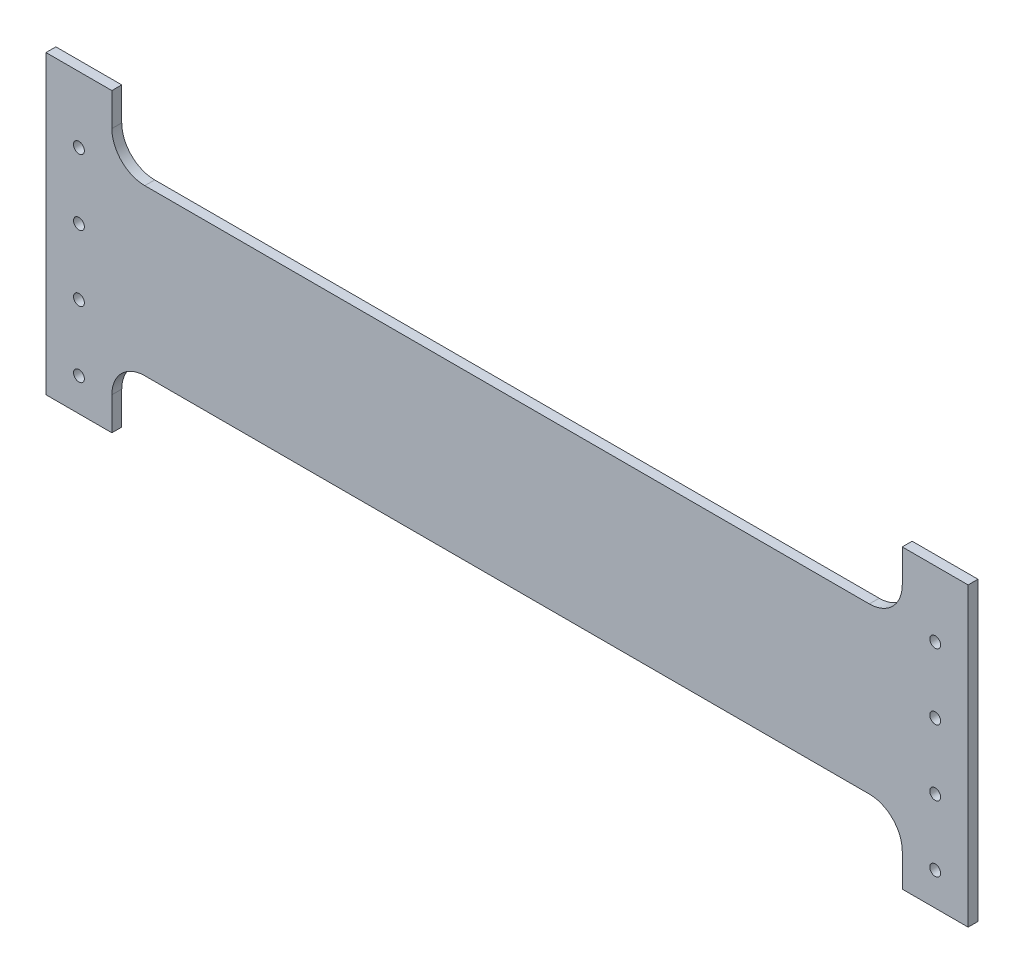
ISO-10303-21;
HEADER;
FILE_DESCRIPTION(('STEP AP214'),'2;1');
FILE_NAME('part.step','',(''),(''),'','','');
FILE_SCHEMA(('AUTOMOTIVE_DESIGN { 1 0 10303 214 1 1 1 1 }'));
ENDSEC;
DATA;
#1=APPLICATION_CONTEXT('core data for automotive mechanical design processes');
#2=APPLICATION_PROTOCOL_DEFINITION('international standard','automotive_design',2000,#1);
#3=PRODUCT_CONTEXT('',#1,'mechanical');
#4=PRODUCT('Part','Part','',(#3));
#5=PRODUCT_RELATED_PRODUCT_CATEGORY('part','',(#4));
#6=PRODUCT_DEFINITION_FORMATION('','',#4);
#7=PRODUCT_DEFINITION_CONTEXT('part definition',#1,'design');
#8=PRODUCT_DEFINITION('design','',#6,#7);
#9=PRODUCT_DEFINITION_SHAPE('','',#8);
#10=(LENGTH_UNIT() NAMED_UNIT(*) SI_UNIT(.MILLI.,.METRE.));
#11=(NAMED_UNIT(*) PLANE_ANGLE_UNIT() SI_UNIT($,.RADIAN.));
#12=(NAMED_UNIT(*) SI_UNIT($,.STERADIAN.) SOLID_ANGLE_UNIT());
#13=UNCERTAINTY_MEASURE_WITH_UNIT(LENGTH_MEASURE(1.E-05),#10,'distance_accuracy_value','');
#14=(GEOMETRIC_REPRESENTATION_CONTEXT(3) GLOBAL_UNCERTAINTY_ASSIGNED_CONTEXT((#13)) GLOBAL_UNIT_ASSIGNED_CONTEXT((#10,
#11,#12)) REPRESENTATION_CONTEXT('',''));
#15=CARTESIAN_POINT('',(0.,0.,0.));
#16=DIRECTION('',(0.,0.,1.));
#17=DIRECTION('',(1.,0.,0.));
#18=AXIS2_PLACEMENT_3D('',#15,#16,#17);
#19=CARTESIAN_POINT('',(-110.,35.,3.));
#20=DIRECTION('',(0.,0.,-1.));
#21=DIRECTION('',(-1.,0.,0.));
#22=AXIS2_PLACEMENT_3D('',#19,#20,#21);
#23=PLANE('',#22);
#24=DIRECTION('',(1.,0.,0.));
#25=VECTOR('',#24,1.);
#26=CARTESIAN_POINT('',(-120.,-44.9999999999999,3.));
#27=LINE('',#26,#25);
#28=CARTESIAN_POINT('',(-140.,-44.9999999999999,3.));
#29=VERTEX_POINT('',#28);
#30=CARTESIAN_POINT('',(-120.,-44.9999999999999,3.));
#31=VERTEX_POINT('',#30);
#32=EDGE_CURVE('E217',#29,#31,#27,.T.);
#33=ORIENTED_EDGE('',*,*,#32,.T.);
#34=DIRECTION('',(0.,1.,0.));
#35=VECTOR('',#34,1.);
#36=CARTESIAN_POINT('',(-120.,-44.9999999999999,3.));
#37=LINE('',#36,#35);
#38=CARTESIAN_POINT('',(-120.,-35.,3.));
#39=VERTEX_POINT('',#38);
#40=EDGE_CURVE('E125',#31,#39,#37,.T.);
#41=ORIENTED_EDGE('',*,*,#40,.T.);
#42=CARTESIAN_POINT('',(-110.,-35.,3.));
#43=DIRECTION('',(0.,0.,-1.));
#44=DIRECTION('',(-1.,0.,0.));
#45=AXIS2_PLACEMENT_3D('',#42,#43,#44);
#46=CIRCLE('',#45,9.99999999999998);
#47=CARTESIAN_POINT('',(-110.,-25.,3.));
#48=VERTEX_POINT('',#47);
#49=EDGE_CURVE('E256',#39,#48,#46,.T.);
#50=ORIENTED_EDGE('',*,*,#49,.T.);
#51=DIRECTION('',(1.,0.,0.));
#52=VECTOR('',#51,1.);
#53=CARTESIAN_POINT('',(-110.,-25.,3.));
#54=LINE('',#53,#52);
#55=CARTESIAN_POINT('',(110.,-25.,3.));
#56=VERTEX_POINT('',#55);
#57=EDGE_CURVE('E275',#48,#56,#54,.T.);
#58=ORIENTED_EDGE('',*,*,#57,.T.);
#59=CARTESIAN_POINT('',(110.,-35.,3.));
#60=DIRECTION('',(0.,0.,-1.));
#61=DIRECTION('',(1.,0.,0.));
#62=AXIS2_PLACEMENT_3D('',#59,#60,#61);
#63=CIRCLE('',#62,9.99999999999998);
#64=CARTESIAN_POINT('',(120.,-35.,3.));
#65=VERTEX_POINT('',#64);
#66=EDGE_CURVE('E272',#56,#65,#63,.T.);
#67=ORIENTED_EDGE('',*,*,#66,.T.);
#68=DIRECTION('',(0.,-1.,0.));
#69=VECTOR('',#68,1.);
#70=CARTESIAN_POINT('',(120.,-44.9999999999999,3.));
#71=LINE('',#70,#69);
#72=CARTESIAN_POINT('',(120.,-44.9999999999999,3.));
#73=VERTEX_POINT('',#72);
#74=EDGE_CURVE('E274',#65,#73,#71,.T.);
#75=ORIENTED_EDGE('',*,*,#74,.T.);
#76=DIRECTION('',(1.,0.,0.));
#77=VECTOR('',#76,1.);
#78=CARTESIAN_POINT('',(120.,-44.9999999999999,3.));
#79=LINE('',#78,#77);
#80=CARTESIAN_POINT('',(140.,-44.9999999999999,3.));
#81=VERTEX_POINT('',#80);
#82=EDGE_CURVE('E277',#73,#81,#79,.T.);
#83=ORIENTED_EDGE('',*,*,#82,.T.);
#84=DIRECTION('',(0.,1.,0.));
#85=VECTOR('',#84,1.);
#86=CARTESIAN_POINT('',(140.,45.,3.));
#87=LINE('',#86,#85);
#88=CARTESIAN_POINT('',(140.,45.,3.));
#89=VERTEX_POINT('',#88);
#90=EDGE_CURVE('E283',#81,#89,#87,.T.);
#91=ORIENTED_EDGE('',*,*,#90,.T.);
#92=DIRECTION('',(-1.,0.,0.));
#93=VECTOR('',#92,1.);
#94=CARTESIAN_POINT('',(120.,45.,3.));
#95=LINE('',#94,#93);
#96=CARTESIAN_POINT('',(120.,45.,3.));
#97=VERTEX_POINT('',#96);
#98=EDGE_CURVE('E285',#89,#97,#95,.T.);
#99=ORIENTED_EDGE('',*,*,#98,.T.);
#100=DIRECTION('',(0.,-1.,0.));
#101=VECTOR('',#100,1.);
#102=CARTESIAN_POINT('',(120.,35.,3.));
#103=LINE('',#102,#101);
#104=CARTESIAN_POINT('',(120.,35.,3.));
#105=VERTEX_POINT('',#104);
#106=EDGE_CURVE('E287',#97,#105,#103,.T.);
#107=ORIENTED_EDGE('',*,*,#106,.T.);
#108=CARTESIAN_POINT('',(110.,35.,3.));
#109=DIRECTION('',(0.,0.,-1.));
#110=DIRECTION('',(-1.,0.,0.));
#111=AXIS2_PLACEMENT_3D('',#108,#109,#110);
#112=CIRCLE('',#111,10.);
#113=CARTESIAN_POINT('',(110.,25.,3.));
#114=VERTEX_POINT('',#113);
#115=EDGE_CURVE('E289',#105,#114,#112,.T.);
#116=ORIENTED_EDGE('',*,*,#115,.T.);
#117=DIRECTION('',(-1.,0.,0.));
#118=VECTOR('',#117,1.);
#119=CARTESIAN_POINT('',(-110.,25.,3.));
#120=LINE('',#119,#118);
#121=CARTESIAN_POINT('',(-110.,25.,3.));
#122=VERTEX_POINT('',#121);
#123=EDGE_CURVE('E291',#114,#122,#120,.T.);
#124=ORIENTED_EDGE('',*,*,#123,.T.);
#125=CARTESIAN_POINT('',(-110.,35.,3.));
#126=DIRECTION('',(0.,0.,-1.));
#127=DIRECTION('',(-1.,0.,0.));
#128=AXIS2_PLACEMENT_3D('',#125,#126,#127);
#129=CIRCLE('',#128,10.);
#130=CARTESIAN_POINT('',(-120.,35.,3.));
#131=VERTEX_POINT('',#130);
#132=EDGE_CURVE('E168',#122,#131,#129,.T.);
#133=ORIENTED_EDGE('',*,*,#132,.T.);
#134=DIRECTION('',(0.,1.,0.));
#135=VECTOR('',#134,1.);
#136=CARTESIAN_POINT('',(-120.,35.,3.));
#137=LINE('',#136,#135);
#138=CARTESIAN_POINT('',(-120.,45.,3.));
#139=VERTEX_POINT('',#138);
#140=EDGE_CURVE('E162',#131,#139,#137,.T.);
#141=ORIENTED_EDGE('',*,*,#140,.T.);
#142=DIRECTION('',(-1.,0.,0.));
#143=VECTOR('',#142,1.);
#144=CARTESIAN_POINT('',(-120.,45.,3.));
#145=LINE('',#144,#143);
#146=CARTESIAN_POINT('',(-140.,45.,3.));
#147=VERTEX_POINT('',#146);
#148=EDGE_CURVE('E166',#139,#147,#145,.T.);
#149=ORIENTED_EDGE('',*,*,#148,.T.);
#150=DIRECTION('',(0.,-1.,0.));
#151=VECTOR('',#150,1.);
#152=CARTESIAN_POINT('',(-140.,45.,3.));
#153=LINE('',#152,#151);
#154=EDGE_CURVE('E58',#147,#29,#153,.T.);
#155=ORIENTED_EDGE('',*,*,#154,.T.);
#156=EDGE_LOOP('',(#33,#41,#50,#58,#67,#75,#83,#91,#99,#107,#116,#124,#133,#141,#149,#155));
#157=FACE_BOUND('',#156,.T.);
#158=CARTESIAN_POINT('',(-130.,25.,3.));
#159=DIRECTION('',(0.,0.,1.));
#160=DIRECTION('',(1.,0.,0.));
#161=AXIS2_PLACEMENT_3D('',#158,#159,#160);
#162=CIRCLE('',#161,1.65000000000002);
#163=CARTESIAN_POINT('',(-128.35,25.,3.));
#164=VERTEX_POINT('',#163);
#165=EDGE_CURVE('E190',#164,#164,#162,.T.);
#166=ORIENTED_EDGE('',*,*,#165,.F.);
#167=EDGE_LOOP('',(#166));
#168=FACE_BOUND('',#167,.T.);
#169=CARTESIAN_POINT('',(-130.,4.99999999999999,3.));
#170=DIRECTION('',(0.,0.,1.));
#171=DIRECTION('',(1.,0.,0.));
#172=AXIS2_PLACEMENT_3D('',#169,#170,#171);
#173=CIRCLE('',#172,1.65000000000002);
#174=CARTESIAN_POINT('',(-128.35,4.99999999999999,3.));
#175=VERTEX_POINT('',#174);
#176=EDGE_CURVE('E395',#175,#175,#173,.T.);
#177=ORIENTED_EDGE('',*,*,#176,.F.);
#178=EDGE_LOOP('',(#177));
#179=FACE_BOUND('',#178,.T.);
#180=CARTESIAN_POINT('',(-130.,-15.,3.));
#181=DIRECTION('',(0.,0.,1.));
#182=DIRECTION('',(1.,0.,0.));
#183=AXIS2_PLACEMENT_3D('',#180,#181,#182);
#184=CIRCLE('',#183,1.65000000000002);
#185=CARTESIAN_POINT('',(-128.35,-15.,3.));
#186=VERTEX_POINT('',#185);
#187=EDGE_CURVE('E389',#186,#186,#184,.T.);
#188=ORIENTED_EDGE('',*,*,#187,.F.);
#189=EDGE_LOOP('',(#188));
#190=FACE_BOUND('',#189,.T.);
#191=CARTESIAN_POINT('',(-130.,-35.,3.));
#192=DIRECTION('',(0.,0.,1.));
#193=DIRECTION('',(1.,0.,0.));
#194=AXIS2_PLACEMENT_3D('',#191,#192,#193);
#195=CIRCLE('',#194,1.65000000000002);
#196=CARTESIAN_POINT('',(-128.35,-35.,3.));
#197=VERTEX_POINT('',#196);
#198=EDGE_CURVE('E383',#197,#197,#195,.T.);
#199=ORIENTED_EDGE('',*,*,#198,.F.);
#200=EDGE_LOOP('',(#199));
#201=FACE_BOUND('',#200,.T.);
#202=CARTESIAN_POINT('',(130.,-35.,3.));
#203=DIRECTION('',(0.,0.,1.));
#204=DIRECTION('',(-1.,0.,0.));
#205=AXIS2_PLACEMENT_3D('',#202,#203,#204);
#206=CIRCLE('',#205,1.65000000000002);
#207=CARTESIAN_POINT('',(128.35,-35.,3.));
#208=VERTEX_POINT('',#207);
#209=EDGE_CURVE('E377',#208,#208,#206,.T.);
#210=ORIENTED_EDGE('',*,*,#209,.F.);
#211=EDGE_LOOP('',(#210));
#212=FACE_BOUND('',#211,.T.);
#213=CARTESIAN_POINT('',(130.,-15.,3.));
#214=DIRECTION('',(0.,0.,1.));
#215=DIRECTION('',(-1.,0.,0.));
#216=AXIS2_PLACEMENT_3D('',#213,#214,#215);
#217=CIRCLE('',#216,1.65000000000002);
#218=CARTESIAN_POINT('',(128.35,-15.,3.));
#219=VERTEX_POINT('',#218);
#220=EDGE_CURVE('E371',#219,#219,#217,.T.);
#221=ORIENTED_EDGE('',*,*,#220,.F.);
#222=EDGE_LOOP('',(#221));
#223=FACE_BOUND('',#222,.T.);
#224=CARTESIAN_POINT('',(130.,4.99999999999999,3.));
#225=DIRECTION('',(0.,0.,1.));
#226=DIRECTION('',(-1.,0.,0.));
#227=AXIS2_PLACEMENT_3D('',#224,#225,#226);
#228=CIRCLE('',#227,1.65000000000002);
#229=CARTESIAN_POINT('',(128.35,4.99999999999999,3.));
#230=VERTEX_POINT('',#229);
#231=EDGE_CURVE('E365',#230,#230,#228,.T.);
#232=ORIENTED_EDGE('',*,*,#231,.F.);
#233=EDGE_LOOP('',(#232));
#234=FACE_BOUND('',#233,.T.);
#235=CARTESIAN_POINT('',(130.,25.,3.));
#236=DIRECTION('',(0.,0.,1.));
#237=DIRECTION('',(-1.,0.,0.));
#238=AXIS2_PLACEMENT_3D('',#235,#236,#237);
#239=CIRCLE('',#238,1.65000000000002);
#240=CARTESIAN_POINT('',(128.35,25.,3.));
#241=VERTEX_POINT('',#240);
#242=EDGE_CURVE('E356',#241,#241,#239,.T.);
#243=ORIENTED_EDGE('',*,*,#242,.F.);
#244=EDGE_LOOP('',(#243));
#245=FACE_BOUND('',#244,.T.);
#246=ADVANCED_FACE('F41',(#157,#168,#179,#190,#201,#212,#223,#234,#245),#23,.F.);
#247=CARTESIAN_POINT('',(-110.,35.,0.));
#248=DIRECTION('',(0.,0.,-1.));
#249=DIRECTION('',(-1.,0.,0.));
#250=AXIS2_PLACEMENT_3D('',#247,#248,#249);
#251=PLANE('',#250);
#252=CARTESIAN_POINT('',(130.,4.99999999999999,0.));
#253=DIRECTION('',(0.,0.,1.));
#254=DIRECTION('',(-1.,0.,0.));
#255=AXIS2_PLACEMENT_3D('',#252,#253,#254);
#256=CIRCLE('',#255,1.65000000000002);
#257=CARTESIAN_POINT('',(128.35,4.99999999999999,0.));
#258=VERTEX_POINT('',#257);
#259=EDGE_CURVE('E362',#258,#258,#256,.T.);
#260=ORIENTED_EDGE('',*,*,#259,.T.);
#261=EDGE_LOOP('',(#260));
#262=FACE_BOUND('',#261,.T.);
#263=CARTESIAN_POINT('',(130.,-35.,0.));
#264=DIRECTION('',(0.,0.,1.));
#265=DIRECTION('',(-1.,0.,0.));
#266=AXIS2_PLACEMENT_3D('',#263,#264,#265);
#267=CIRCLE('',#266,1.65000000000002);
#268=CARTESIAN_POINT('',(128.35,-35.,0.));
#269=VERTEX_POINT('',#268);
#270=EDGE_CURVE('E374',#269,#269,#267,.T.);
#271=ORIENTED_EDGE('',*,*,#270,.T.);
#272=EDGE_LOOP('',(#271));
#273=FACE_BOUND('',#272,.T.);
#274=CARTESIAN_POINT('',(-130.,-15.,0.));
#275=DIRECTION('',(0.,0.,1.));
#276=DIRECTION('',(1.,0.,0.));
#277=AXIS2_PLACEMENT_3D('',#274,#275,#276);
#278=CIRCLE('',#277,1.65000000000002);
#279=CARTESIAN_POINT('',(-128.35,-15.,0.));
#280=VERTEX_POINT('',#279);
#281=EDGE_CURVE('E386',#280,#280,#278,.T.);
#282=ORIENTED_EDGE('',*,*,#281,.T.);
#283=EDGE_LOOP('',(#282));
#284=FACE_BOUND('',#283,.T.);
#285=CARTESIAN_POINT('',(-130.,25.,0.));
#286=DIRECTION('',(0.,0.,1.));
#287=DIRECTION('',(1.,0.,0.));
#288=AXIS2_PLACEMENT_3D('',#285,#286,#287);
#289=CIRCLE('',#288,1.65000000000002);
#290=CARTESIAN_POINT('',(-128.35,25.,0.));
#291=VERTEX_POINT('',#290);
#292=EDGE_CURVE('E398',#291,#291,#289,.T.);
#293=ORIENTED_EDGE('',*,*,#292,.T.);
#294=EDGE_LOOP('',(#293));
#295=FACE_BOUND('',#294,.T.);
#296=DIRECTION('',(1.,0.,0.));
#297=VECTOR('',#296,1.);
#298=CARTESIAN_POINT('',(-120.,-44.9999999999999,0.));
#299=LINE('',#298,#297);
#300=CARTESIAN_POINT('',(-140.,-44.9999999999999,0.));
#301=VERTEX_POINT('',#300);
#302=CARTESIAN_POINT('',(-120.,-44.9999999999999,0.));
#303=VERTEX_POINT('',#302);
#304=EDGE_CURVE('E186',#301,#303,#299,.T.);
#305=ORIENTED_EDGE('',*,*,#304,.F.);
#306=DIRECTION('',(0.,-1.,0.));
#307=VECTOR('',#306,1.);
#308=CARTESIAN_POINT('',(-140.,45.,0.));
#309=LINE('',#308,#307);
#310=CARTESIAN_POINT('',(-140.,45.,0.));
#311=VERTEX_POINT('',#310);
#312=EDGE_CURVE('E117',#311,#301,#309,.T.);
#313=ORIENTED_EDGE('',*,*,#312,.F.);
#314=DIRECTION('',(-1.,0.,0.));
#315=VECTOR('',#314,1.);
#316=CARTESIAN_POINT('',(-120.,45.,0.));
#317=LINE('',#316,#315);
#318=CARTESIAN_POINT('',(-120.,45.,0.));
#319=VERTEX_POINT('',#318);
#320=EDGE_CURVE('E111',#319,#311,#317,.T.);
#321=ORIENTED_EDGE('',*,*,#320,.F.);
#322=DIRECTION('',(0.,1.,0.));
#323=VECTOR('',#322,1.);
#324=CARTESIAN_POINT('',(-120.,35.,0.));
#325=LINE('',#324,#323);
#326=CARTESIAN_POINT('',(-120.,35.,0.));
#327=VERTEX_POINT('',#326);
#328=EDGE_CURVE('E176',#327,#319,#325,.T.);
#329=ORIENTED_EDGE('',*,*,#328,.F.);
#330=CARTESIAN_POINT('',(-110.,35.,0.));
#331=DIRECTION('',(0.,0.,-1.));
#332=DIRECTION('',(-1.,0.,0.));
#333=AXIS2_PLACEMENT_3D('',#330,#331,#332);
#334=CIRCLE('',#333,10.);
#335=CARTESIAN_POINT('',(-110.,25.,0.));
#336=VERTEX_POINT('',#335);
#337=EDGE_CURVE('E212',#336,#327,#334,.T.);
#338=ORIENTED_EDGE('',*,*,#337,.F.);
#339=DIRECTION('',(-1.,0.,0.));
#340=VECTOR('',#339,1.);
#341=CARTESIAN_POINT('',(-110.,25.,0.));
#342=LINE('',#341,#340);
#343=CARTESIAN_POINT('',(110.,25.,0.));
#344=VERTEX_POINT('',#343);
#345=EDGE_CURVE('E210',#344,#336,#342,.T.);
#346=ORIENTED_EDGE('',*,*,#345,.F.);
#347=CARTESIAN_POINT('',(110.,35.,0.));
#348=DIRECTION('',(0.,0.,-1.));
#349=DIRECTION('',(-1.,0.,0.));
#350=AXIS2_PLACEMENT_3D('',#347,#348,#349);
#351=CIRCLE('',#350,10.);
#352=CARTESIAN_POINT('',(120.,35.,0.));
#353=VERTEX_POINT('',#352);
#354=EDGE_CURVE('E208',#353,#344,#351,.T.);
#355=ORIENTED_EDGE('',*,*,#354,.F.);
#356=DIRECTION('',(0.,-1.,0.));
#357=VECTOR('',#356,1.);
#358=CARTESIAN_POINT('',(120.,35.,0.));
#359=LINE('',#358,#357);
#360=CARTESIAN_POINT('',(120.,45.,0.));
#361=VERTEX_POINT('',#360);
#362=EDGE_CURVE('E206',#361,#353,#359,.T.);
#363=ORIENTED_EDGE('',*,*,#362,.F.);
#364=DIRECTION('',(-1.,0.,0.));
#365=VECTOR('',#364,1.);
#366=CARTESIAN_POINT('',(120.,45.,0.));
#367=LINE('',#366,#365);
#368=CARTESIAN_POINT('',(140.,45.,0.));
#369=VERTEX_POINT('',#368);
#370=EDGE_CURVE('E204',#369,#361,#367,.T.);
#371=ORIENTED_EDGE('',*,*,#370,.F.);
#372=DIRECTION('',(0.,1.,0.));
#373=VECTOR('',#372,1.);
#374=CARTESIAN_POINT('',(140.,45.,0.));
#375=LINE('',#374,#373);
#376=CARTESIAN_POINT('',(140.,-44.9999999999999,0.));
#377=VERTEX_POINT('',#376);
#378=EDGE_CURVE('E202',#377,#369,#375,.T.);
#379=ORIENTED_EDGE('',*,*,#378,.F.);
#380=DIRECTION('',(1.,0.,0.));
#381=VECTOR('',#380,1.);
#382=CARTESIAN_POINT('',(120.,-44.9999999999999,0.));
#383=LINE('',#382,#381);
#384=CARTESIAN_POINT('',(120.,-44.9999999999999,0.));
#385=VERTEX_POINT('',#384);
#386=EDGE_CURVE('E200',#385,#377,#383,.T.);
#387=ORIENTED_EDGE('',*,*,#386,.F.);
#388=DIRECTION('',(0.,-1.,0.));
#389=VECTOR('',#388,1.);
#390=CARTESIAN_POINT('',(120.,-44.9999999999999,0.));
#391=LINE('',#390,#389);
#392=CARTESIAN_POINT('',(120.,-35.,0.));
#393=VERTEX_POINT('',#392);
#394=EDGE_CURVE('E198',#393,#385,#391,.T.);
#395=ORIENTED_EDGE('',*,*,#394,.F.);
#396=CARTESIAN_POINT('',(110.,-35.,0.));
#397=DIRECTION('',(0.,0.,-1.));
#398=DIRECTION('',(1.,0.,0.));
#399=AXIS2_PLACEMENT_3D('',#396,#397,#398);
#400=CIRCLE('',#399,9.99999999999998);
#401=CARTESIAN_POINT('',(110.,-25.,0.));
#402=VERTEX_POINT('',#401);
#403=EDGE_CURVE('E196',#402,#393,#400,.T.);
#404=ORIENTED_EDGE('',*,*,#403,.F.);
#405=DIRECTION('',(1.,0.,0.));
#406=VECTOR('',#405,1.);
#407=CARTESIAN_POINT('',(-110.,-25.,0.));
#408=LINE('',#407,#406);
#409=CARTESIAN_POINT('',(-110.,-25.,0.));
#410=VERTEX_POINT('',#409);
#411=EDGE_CURVE('E194',#410,#402,#408,.T.);
#412=ORIENTED_EDGE('',*,*,#411,.F.);
#413=CARTESIAN_POINT('',(-110.,-35.,0.));
#414=DIRECTION('',(0.,0.,-1.));
#415=DIRECTION('',(-1.,0.,0.));
#416=AXIS2_PLACEMENT_3D('',#413,#414,#415);
#417=CIRCLE('',#416,9.99999999999998);
#418=CARTESIAN_POINT('',(-120.,-35.,0.));
#419=VERTEX_POINT('',#418);
#420=EDGE_CURVE('E192',#419,#410,#417,.T.);
#421=ORIENTED_EDGE('',*,*,#420,.F.);
#422=DIRECTION('',(0.,1.,0.));
#423=VECTOR('',#422,1.);
#424=CARTESIAN_POINT('',(-120.,-44.9999999999999,0.));
#425=LINE('',#424,#423);
#426=EDGE_CURVE('E189',#303,#419,#425,.T.);
#427=ORIENTED_EDGE('',*,*,#426,.F.);
#428=EDGE_LOOP('',(#305,#313,#321,#329,#338,#346,#355,#363,#371,#379,#387,#395,#404,#412,#421,#427));
#429=FACE_BOUND('',#428,.T.);
#430=CARTESIAN_POINT('',(-130.,4.99999999999999,0.));
#431=DIRECTION('',(0.,0.,1.));
#432=DIRECTION('',(1.,0.,0.));
#433=AXIS2_PLACEMENT_3D('',#430,#431,#432);
#434=CIRCLE('',#433,1.65000000000002);
#435=CARTESIAN_POINT('',(-128.35,4.99999999999999,0.));
#436=VERTEX_POINT('',#435);
#437=EDGE_CURVE('E392',#436,#436,#434,.T.);
#438=ORIENTED_EDGE('',*,*,#437,.T.);
#439=EDGE_LOOP('',(#438));
#440=FACE_BOUND('',#439,.T.);
#441=CARTESIAN_POINT('',(-130.,-35.,0.));
#442=DIRECTION('',(0.,0.,1.));
#443=DIRECTION('',(1.,0.,0.));
#444=AXIS2_PLACEMENT_3D('',#441,#442,#443);
#445=CIRCLE('',#444,1.65000000000002);
#446=CARTESIAN_POINT('',(-128.35,-35.,0.));
#447=VERTEX_POINT('',#446);
#448=EDGE_CURVE('E380',#447,#447,#445,.T.);
#449=ORIENTED_EDGE('',*,*,#448,.T.);
#450=EDGE_LOOP('',(#449));
#451=FACE_BOUND('',#450,.T.);
#452=CARTESIAN_POINT('',(130.,-15.,0.));
#453=DIRECTION('',(0.,0.,1.));
#454=DIRECTION('',(-1.,0.,0.));
#455=AXIS2_PLACEMENT_3D('',#452,#453,#454);
#456=CIRCLE('',#455,1.65000000000002);
#457=CARTESIAN_POINT('',(128.35,-15.,0.));
#458=VERTEX_POINT('',#457);
#459=EDGE_CURVE('E368',#458,#458,#456,.T.);
#460=ORIENTED_EDGE('',*,*,#459,.T.);
#461=EDGE_LOOP('',(#460));
#462=FACE_BOUND('',#461,.T.);
#463=CARTESIAN_POINT('',(130.,25.,0.));
#464=DIRECTION('',(0.,0.,1.));
#465=DIRECTION('',(-1.,0.,0.));
#466=AXIS2_PLACEMENT_3D('',#463,#464,#465);
#467=CIRCLE('',#466,1.65000000000002);
#468=CARTESIAN_POINT('',(128.35,25.,0.));
#469=VERTEX_POINT('',#468);
#470=EDGE_CURVE('E359',#469,#469,#467,.T.);
#471=ORIENTED_EDGE('',*,*,#470,.T.);
#472=EDGE_LOOP('',(#471));
#473=FACE_BOUND('',#472,.T.);
#474=ADVANCED_FACE('F260',(#262,#273,#284,#295,#429,#440,#451,#462,#473),#251,.T.);
#475=CARTESIAN_POINT('',(-120.,-44.9999999999999,3.));
#476=DIRECTION('',(0.,1.,0.));
#477=DIRECTION('',(0.,0.,1.));
#478=AXIS2_PLACEMENT_3D('',#475,#476,#477);
#479=PLANE('',#478);
#480=ORIENTED_EDGE('',*,*,#304,.T.);
#481=DIRECTION('',(0.,0.,-1.));
#482=VECTOR('',#481,1.);
#483=CARTESIAN_POINT('',(-120.,-44.9999999999999,3.));
#484=LINE('',#483,#482);
#485=EDGE_CURVE('E11',#31,#303,#484,.T.);
#486=ORIENTED_EDGE('',*,*,#485,.F.);
#487=ORIENTED_EDGE('',*,*,#32,.F.);
#488=DIRECTION('',(0.,0.,-1.));
#489=VECTOR('',#488,1.);
#490=CARTESIAN_POINT('',(-140.,-44.9999999999999,3.));
#491=LINE('',#490,#489);
#492=EDGE_CURVE('E182',#29,#301,#491,.T.);
#493=ORIENTED_EDGE('',*,*,#492,.T.);
#494=EDGE_LOOP('',(#480,#486,#487,#493));
#495=FACE_BOUND('',#494,.T.);
#496=ADVANCED_FACE('F43',(#495),#479,.F.);
#497=CARTESIAN_POINT('',(-120.,-44.9999999999999,3.));
#498=DIRECTION('',(-1.,0.,0.));
#499=DIRECTION('',(0.,-1.,0.));
#500=AXIS2_PLACEMENT_3D('',#497,#498,#499);
#501=PLANE('',#500);
#502=ORIENTED_EDGE('',*,*,#426,.T.);
#503=DIRECTION('',(0.,0.,-1.));
#504=VECTOR('',#503,1.);
#505=CARTESIAN_POINT('',(-120.,-35.,3.));
#506=LINE('',#505,#504);
#507=EDGE_CURVE('E50',#39,#419,#506,.T.);
#508=ORIENTED_EDGE('',*,*,#507,.F.);
#509=ORIENTED_EDGE('',*,*,#40,.F.);
#510=ORIENTED_EDGE('',*,*,#485,.T.);
#511=EDGE_LOOP('',(#502,#508,#509,#510));
#512=FACE_BOUND('',#511,.T.);
#513=ADVANCED_FACE('F594',(#512),#501,.F.);
#514=CARTESIAN_POINT('',(-110.,-35.,3.));
#515=DIRECTION('',(0.,0.,-1.));
#516=DIRECTION('',(-1.,0.,0.));
#517=AXIS2_PLACEMENT_3D('',#514,#515,#516);
#518=CYLINDRICAL_SURFACE('',#517,9.99999999999998);
#519=ORIENTED_EDGE('',*,*,#420,.T.);
#520=DIRECTION('',(0.,0.,-1.));
#521=VECTOR('',#520,1.);
#522=CARTESIAN_POINT('',(-110.,-25.,3.));
#523=LINE('',#522,#521);
#524=EDGE_CURVE('E248',#48,#410,#523,.T.);
#525=ORIENTED_EDGE('',*,*,#524,.F.);
#526=ORIENTED_EDGE('',*,*,#49,.F.);
#527=ORIENTED_EDGE('',*,*,#507,.T.);
#528=EDGE_LOOP('',(#519,#525,#526,#527));
#529=FACE_BOUND('',#528,.T.);
#530=ADVANCED_FACE('F254',(#529),#518,.F.);
#531=CARTESIAN_POINT('',(-110.,-25.,3.));
#532=DIRECTION('',(0.,1.,0.));
#533=DIRECTION('',(0.,0.,1.));
#534=AXIS2_PLACEMENT_3D('',#531,#532,#533);
#535=PLANE('',#534);
#536=ORIENTED_EDGE('',*,*,#411,.T.);
#537=DIRECTION('',(0.,0.,-1.));
#538=VECTOR('',#537,1.);
#539=CARTESIAN_POINT('',(110.,-25.,3.));
#540=LINE('',#539,#538);
#541=EDGE_CURVE('E245',#56,#402,#540,.T.);
#542=ORIENTED_EDGE('',*,*,#541,.F.);
#543=ORIENTED_EDGE('',*,*,#57,.F.);
#544=ORIENTED_EDGE('',*,*,#524,.T.);
#545=EDGE_LOOP('',(#536,#542,#543,#544));
#546=FACE_BOUND('',#545,.T.);
#547=ADVANCED_FACE('F266',(#546),#535,.F.);
#548=CARTESIAN_POINT('',(110.,-35.,3.));
#549=DIRECTION('',(0.,0.,-1.));
#550=DIRECTION('',(-1.,0.,0.));
#551=AXIS2_PLACEMENT_3D('',#548,#549,#550);
#552=CYLINDRICAL_SURFACE('',#551,9.99999999999998);
#553=ORIENTED_EDGE('',*,*,#403,.T.);
#554=DIRECTION('',(0.,0.,-1.));
#555=VECTOR('',#554,1.);
#556=CARTESIAN_POINT('',(120.,-35.,3.));
#557=LINE('',#556,#555);
#558=EDGE_CURVE('E242',#65,#393,#557,.T.);
#559=ORIENTED_EDGE('',*,*,#558,.F.);
#560=ORIENTED_EDGE('',*,*,#66,.F.);
#561=ORIENTED_EDGE('',*,*,#541,.T.);
#562=EDGE_LOOP('',(#553,#559,#560,#561));
#563=FACE_BOUND('',#562,.T.);
#564=ADVANCED_FACE('F270',(#563),#552,.F.);
#565=CARTESIAN_POINT('',(120.,-44.9999999999999,3.));
#566=DIRECTION('',(1.,0.,0.));
#567=DIRECTION('',(0.,1.,0.));
#568=AXIS2_PLACEMENT_3D('',#565,#566,#567);
#569=PLANE('',#568);
#570=ORIENTED_EDGE('',*,*,#394,.T.);
#571=DIRECTION('',(0.,0.,-1.));
#572=VECTOR('',#571,1.);
#573=CARTESIAN_POINT('',(120.,-44.9999999999999,3.));
#574=LINE('',#573,#572);
#575=EDGE_CURVE('E239',#73,#385,#574,.T.);
#576=ORIENTED_EDGE('',*,*,#575,.F.);
#577=ORIENTED_EDGE('',*,*,#74,.F.);
#578=ORIENTED_EDGE('',*,*,#558,.T.);
#579=EDGE_LOOP('',(#570,#576,#577,#578));
#580=FACE_BOUND('',#579,.T.);
#581=ADVANCED_FACE('F559',(#580),#569,.F.);
#582=CARTESIAN_POINT('',(120.,-44.9999999999999,3.));
#583=DIRECTION('',(0.,1.,0.));
#584=DIRECTION('',(0.,0.,1.));
#585=AXIS2_PLACEMENT_3D('',#582,#583,#584);
#586=PLANE('',#585);
#587=ORIENTED_EDGE('',*,*,#386,.T.);
#588=DIRECTION('',(0.,0.,-1.));
#589=VECTOR('',#588,1.);
#590=CARTESIAN_POINT('',(140.,-44.9999999999999,3.));
#591=LINE('',#590,#589);
#592=EDGE_CURVE('E236',#81,#377,#591,.T.);
#593=ORIENTED_EDGE('',*,*,#592,.F.);
#594=ORIENTED_EDGE('',*,*,#82,.F.);
#595=ORIENTED_EDGE('',*,*,#575,.T.);
#596=EDGE_LOOP('',(#587,#593,#594,#595));
#597=FACE_BOUND('',#596,.T.);
#598=ADVANCED_FACE('F549',(#597),#586,.F.);
#599=CARTESIAN_POINT('',(140.,45.,3.));
#600=DIRECTION('',(-1.,0.,0.));
#601=DIRECTION('',(0.,-1.,0.));
#602=AXIS2_PLACEMENT_3D('',#599,#600,#601);
#603=PLANE('',#602);
#604=ORIENTED_EDGE('',*,*,#378,.T.);
#605=DIRECTION('',(0.,0.,-1.));
#606=VECTOR('',#605,1.);
#607=CARTESIAN_POINT('',(140.,45.,3.));
#608=LINE('',#607,#606);
#609=EDGE_CURVE('E233',#89,#369,#608,.T.);
#610=ORIENTED_EDGE('',*,*,#609,.F.);
#611=ORIENTED_EDGE('',*,*,#90,.F.);
#612=ORIENTED_EDGE('',*,*,#592,.T.);
#613=EDGE_LOOP('',(#604,#610,#611,#612));
#614=FACE_BOUND('',#613,.T.);
#615=ADVANCED_FACE('F539',(#614),#603,.F.);
#616=CARTESIAN_POINT('',(120.,45.,3.));
#617=DIRECTION('',(0.,-1.,0.));
#618=DIRECTION('',(0.,0.,-1.));
#619=AXIS2_PLACEMENT_3D('',#616,#617,#618);
#620=PLANE('',#619);
#621=ORIENTED_EDGE('',*,*,#370,.T.);
#622=DIRECTION('',(0.,0.,-1.));
#623=VECTOR('',#622,1.);
#624=CARTESIAN_POINT('',(120.,45.,3.));
#625=LINE('',#624,#623);
#626=EDGE_CURVE('E230',#97,#361,#625,.T.);
#627=ORIENTED_EDGE('',*,*,#626,.F.);
#628=ORIENTED_EDGE('',*,*,#98,.F.);
#629=ORIENTED_EDGE('',*,*,#609,.T.);
#630=EDGE_LOOP('',(#621,#627,#628,#629));
#631=FACE_BOUND('',#630,.T.);
#632=ADVANCED_FACE('F529',(#631),#620,.F.);
#633=CARTESIAN_POINT('',(120.,35.,3.));
#634=DIRECTION('',(1.,0.,0.));
#635=DIRECTION('',(0.,0.,-1.));
#636=AXIS2_PLACEMENT_3D('',#633,#634,#635);
#637=PLANE('',#636);
#638=ORIENTED_EDGE('',*,*,#362,.T.);
#639=DIRECTION('',(0.,0.,-1.));
#640=VECTOR('',#639,1.);
#641=CARTESIAN_POINT('',(120.,35.,3.));
#642=LINE('',#641,#640);
#643=EDGE_CURVE('E227',#105,#353,#642,.T.);
#644=ORIENTED_EDGE('',*,*,#643,.F.);
#645=ORIENTED_EDGE('',*,*,#106,.F.);
#646=ORIENTED_EDGE('',*,*,#626,.T.);
#647=EDGE_LOOP('',(#638,#644,#645,#646));
#648=FACE_BOUND('',#647,.T.);
#649=ADVANCED_FACE('F519',(#648),#637,.F.);
#650=CARTESIAN_POINT('',(110.,35.,3.));
#651=DIRECTION('',(0.,0.,-1.));
#652=DIRECTION('',(-1.,0.,0.));
#653=AXIS2_PLACEMENT_3D('',#650,#651,#652);
#654=CYLINDRICAL_SURFACE('',#653,10.);
#655=ORIENTED_EDGE('',*,*,#354,.T.);
#656=DIRECTION('',(0.,0.,-1.));
#657=VECTOR('',#656,1.);
#658=CARTESIAN_POINT('',(110.,25.,3.));
#659=LINE('',#658,#657);
#660=EDGE_CURVE('E224',#114,#344,#659,.T.);
#661=ORIENTED_EDGE('',*,*,#660,.F.);
#662=ORIENTED_EDGE('',*,*,#115,.F.);
#663=ORIENTED_EDGE('',*,*,#643,.T.);
#664=EDGE_LOOP('',(#655,#661,#662,#663));
#665=FACE_BOUND('',#664,.T.);
#666=ADVANCED_FACE('F510',(#665),#654,.F.);
#667=CARTESIAN_POINT('',(-110.,25.,3.));
#668=DIRECTION('',(0.,-1.,0.));
#669=DIRECTION('',(0.,0.,-1.));
#670=AXIS2_PLACEMENT_3D('',#667,#668,#669);
#671=PLANE('',#670);
#672=ORIENTED_EDGE('',*,*,#345,.T.);
#673=DIRECTION('',(0.,0.,-1.));
#674=VECTOR('',#673,1.);
#675=CARTESIAN_POINT('',(-110.,25.,3.));
#676=LINE('',#675,#674);
#677=EDGE_CURVE('E221',#122,#336,#676,.T.);
#678=ORIENTED_EDGE('',*,*,#677,.F.);
#679=ORIENTED_EDGE('',*,*,#123,.F.);
#680=ORIENTED_EDGE('',*,*,#660,.T.);
#681=EDGE_LOOP('',(#672,#678,#679,#680));
#682=FACE_BOUND('',#681,.T.);
#683=ADVANCED_FACE('F297',(#682),#671,.F.);
#684=CARTESIAN_POINT('',(-110.,35.,3.));
#685=DIRECTION('',(0.,0.,-1.));
#686=DIRECTION('',(-1.,0.,0.));
#687=AXIS2_PLACEMENT_3D('',#684,#685,#686);
#688=CYLINDRICAL_SURFACE('',#687,10.);
#689=ORIENTED_EDGE('',*,*,#337,.T.);
#690=DIRECTION('',(0.,0.,-1.));
#691=VECTOR('',#690,1.);
#692=CARTESIAN_POINT('',(-120.,35.,3.));
#693=LINE('',#692,#691);
#694=EDGE_CURVE('E177',#131,#327,#693,.T.);
#695=ORIENTED_EDGE('',*,*,#694,.F.);
#696=ORIENTED_EDGE('',*,*,#132,.F.);
#697=ORIENTED_EDGE('',*,*,#677,.T.);
#698=EDGE_LOOP('',(#689,#695,#696,#697));
#699=FACE_BOUND('',#698,.T.);
#700=ADVANCED_FACE('F301',(#699),#688,.F.);
#701=CARTESIAN_POINT('',(-120.,35.,3.));
#702=DIRECTION('',(-1.,0.,0.));
#703=DIRECTION('',(0.,0.,1.));
#704=AXIS2_PLACEMENT_3D('',#701,#702,#703);
#705=PLANE('',#704);
#706=ORIENTED_EDGE('',*,*,#328,.T.);
#707=DIRECTION('',(0.,0.,-1.));
#708=VECTOR('',#707,1.);
#709=CARTESIAN_POINT('',(-120.,45.,3.));
#710=LINE('',#709,#708);
#711=EDGE_CURVE('E173',#139,#319,#710,.T.);
#712=ORIENTED_EDGE('',*,*,#711,.F.);
#713=ORIENTED_EDGE('',*,*,#140,.F.);
#714=ORIENTED_EDGE('',*,*,#694,.T.);
#715=EDGE_LOOP('',(#706,#712,#713,#714));
#716=FACE_BOUND('',#715,.T.);
#717=ADVANCED_FACE('F174',(#716),#705,.F.);
#718=CARTESIAN_POINT('',(-120.,45.,3.));
#719=DIRECTION('',(0.,-1.,0.));
#720=DIRECTION('',(0.,0.,-1.));
#721=AXIS2_PLACEMENT_3D('',#718,#719,#720);
#722=PLANE('',#721);
#723=ORIENTED_EDGE('',*,*,#320,.T.);
#724=DIRECTION('',(0.,0.,-1.));
#725=VECTOR('',#724,1.);
#726=CARTESIAN_POINT('',(-140.,45.,3.));
#727=LINE('',#726,#725);
#728=EDGE_CURVE('E178',#147,#311,#727,.T.);
#729=ORIENTED_EDGE('',*,*,#728,.F.);
#730=ORIENTED_EDGE('',*,*,#148,.F.);
#731=ORIENTED_EDGE('',*,*,#711,.T.);
#732=EDGE_LOOP('',(#723,#729,#730,#731));
#733=FACE_BOUND('',#732,.T.);
#734=ADVANCED_FACE('F180',(#733),#722,.F.);
#735=CARTESIAN_POINT('',(-140.,45.,3.));
#736=DIRECTION('',(1.,0.,0.));
#737=DIRECTION('',(0.,1.,0.));
#738=AXIS2_PLACEMENT_3D('',#735,#736,#737);
#739=PLANE('',#738);
#740=ORIENTED_EDGE('',*,*,#312,.T.);
#741=ORIENTED_EDGE('',*,*,#492,.F.);
#742=ORIENTED_EDGE('',*,*,#154,.F.);
#743=ORIENTED_EDGE('',*,*,#728,.T.);
#744=EDGE_LOOP('',(#740,#741,#742,#743));
#745=FACE_BOUND('',#744,.T.);
#746=ADVANCED_FACE('F305',(#745),#739,.F.);
#747=CARTESIAN_POINT('',(-130.,25.,3.));
#748=DIRECTION('',(0.,0.,-1.));
#749=DIRECTION('',(-1.,0.,0.));
#750=AXIS2_PLACEMENT_3D('',#747,#748,#749);
#751=CYLINDRICAL_SURFACE('',#750,1.65000000000002);
#752=ORIENTED_EDGE('',*,*,#165,.T.);
#753=EDGE_LOOP('',(#752));
#754=FACE_BOUND('',#753,.T.);
#755=ORIENTED_EDGE('',*,*,#292,.F.);
#756=EDGE_LOOP('',(#755));
#757=FACE_BOUND('',#756,.T.);
#758=ADVANCED_FACE('F307',(#754,#757),#751,.F.);
#759=CARTESIAN_POINT('',(-130.,4.99999999999999,3.));
#760=DIRECTION('',(0.,0.,-1.));
#761=DIRECTION('',(-1.,0.,0.));
#762=AXIS2_PLACEMENT_3D('',#759,#760,#761);
#763=CYLINDRICAL_SURFACE('',#762,1.65000000000002);
#764=ORIENTED_EDGE('',*,*,#176,.T.);
#765=EDGE_LOOP('',(#764));
#766=FACE_BOUND('',#765,.T.);
#767=ORIENTED_EDGE('',*,*,#437,.F.);
#768=EDGE_LOOP('',(#767));
#769=FACE_BOUND('',#768,.T.);
#770=ADVANCED_FACE('F313',(#766,#769),#763,.F.);
#771=CARTESIAN_POINT('',(-130.,-15.,3.));
#772=DIRECTION('',(0.,0.,-1.));
#773=DIRECTION('',(-1.,0.,0.));
#774=AXIS2_PLACEMENT_3D('',#771,#772,#773);
#775=CYLINDRICAL_SURFACE('',#774,1.65000000000002);
#776=ORIENTED_EDGE('',*,*,#187,.T.);
#777=EDGE_LOOP('',(#776));
#778=FACE_BOUND('',#777,.T.);
#779=ORIENTED_EDGE('',*,*,#281,.F.);
#780=EDGE_LOOP('',(#779));
#781=FACE_BOUND('',#780,.T.);
#782=ADVANCED_FACE('F327',(#778,#781),#775,.F.);
#783=CARTESIAN_POINT('',(-130.,-35.,3.));
#784=DIRECTION('',(0.,0.,-1.));
#785=DIRECTION('',(-1.,0.,0.));
#786=AXIS2_PLACEMENT_3D('',#783,#784,#785);
#787=CYLINDRICAL_SURFACE('',#786,1.65000000000002);
#788=ORIENTED_EDGE('',*,*,#198,.T.);
#789=EDGE_LOOP('',(#788));
#790=FACE_BOUND('',#789,.T.);
#791=ORIENTED_EDGE('',*,*,#448,.F.);
#792=EDGE_LOOP('',(#791));
#793=FACE_BOUND('',#792,.T.);
#794=ADVANCED_FACE('F331',(#790,#793),#787,.F.);
#795=CARTESIAN_POINT('',(130.,-35.,3.));
#796=DIRECTION('',(0.,0.,-1.));
#797=DIRECTION('',(-1.,0.,0.));
#798=AXIS2_PLACEMENT_3D('',#795,#796,#797);
#799=CYLINDRICAL_SURFACE('',#798,1.65000000000002);
#800=ORIENTED_EDGE('',*,*,#209,.T.);
#801=EDGE_LOOP('',(#800));
#802=FACE_BOUND('',#801,.T.);
#803=ORIENTED_EDGE('',*,*,#270,.F.);
#804=EDGE_LOOP('',(#803));
#805=FACE_BOUND('',#804,.T.);
#806=ADVANCED_FACE('F335',(#802,#805),#799,.F.);
#807=CARTESIAN_POINT('',(130.,-15.,3.));
#808=DIRECTION('',(0.,0.,-1.));
#809=DIRECTION('',(-1.,0.,0.));
#810=AXIS2_PLACEMENT_3D('',#807,#808,#809);
#811=CYLINDRICAL_SURFACE('',#810,1.65000000000002);
#812=ORIENTED_EDGE('',*,*,#220,.T.);
#813=EDGE_LOOP('',(#812));
#814=FACE_BOUND('',#813,.T.);
#815=ORIENTED_EDGE('',*,*,#459,.F.);
#816=EDGE_LOOP('',(#815));
#817=FACE_BOUND('',#816,.T.);
#818=ADVANCED_FACE('F339',(#814,#817),#811,.F.);
#819=CARTESIAN_POINT('',(130.,4.99999999999999,3.));
#820=DIRECTION('',(0.,0.,-1.));
#821=DIRECTION('',(-1.,0.,0.));
#822=AXIS2_PLACEMENT_3D('',#819,#820,#821);
#823=CYLINDRICAL_SURFACE('',#822,1.65000000000002);
#824=ORIENTED_EDGE('',*,*,#231,.T.);
#825=EDGE_LOOP('',(#824));
#826=FACE_BOUND('',#825,.T.);
#827=ORIENTED_EDGE('',*,*,#259,.F.);
#828=EDGE_LOOP('',(#827));
#829=FACE_BOUND('',#828,.T.);
#830=ADVANCED_FACE('F343',(#826,#829),#823,.F.);
#831=CARTESIAN_POINT('',(130.,25.,3.));
#832=DIRECTION('',(0.,0.,-1.));
#833=DIRECTION('',(-1.,0.,0.));
#834=AXIS2_PLACEMENT_3D('',#831,#832,#833);
#835=CYLINDRICAL_SURFACE('',#834,1.65000000000002);
#836=ORIENTED_EDGE('',*,*,#242,.T.);
#837=EDGE_LOOP('',(#836));
#838=FACE_BOUND('',#837,.T.);
#839=ORIENTED_EDGE('',*,*,#470,.F.);
#840=EDGE_LOOP('',(#839));
#841=FACE_BOUND('',#840,.T.);
#842=ADVANCED_FACE('F347',(#838,#841),#835,.F.);
#843=CLOSED_SHELL('',(#246,#474,#496,#513,#530,#547,#564,#581,#598,#615,#632,#649,#666,#683,
#700,#717,#734,#746,#758,#770,#782,#794,#806,#818,#830,#842));
#844=MANIFOLD_SOLID_BREP('B2',#843);
#845=ADVANCED_BREP_SHAPE_REPRESENTATION('',(#18,#844),#14);
#846=SHAPE_DEFINITION_REPRESENTATION(#9,#845);
ENDSEC;
END-ISO-10303-21;
